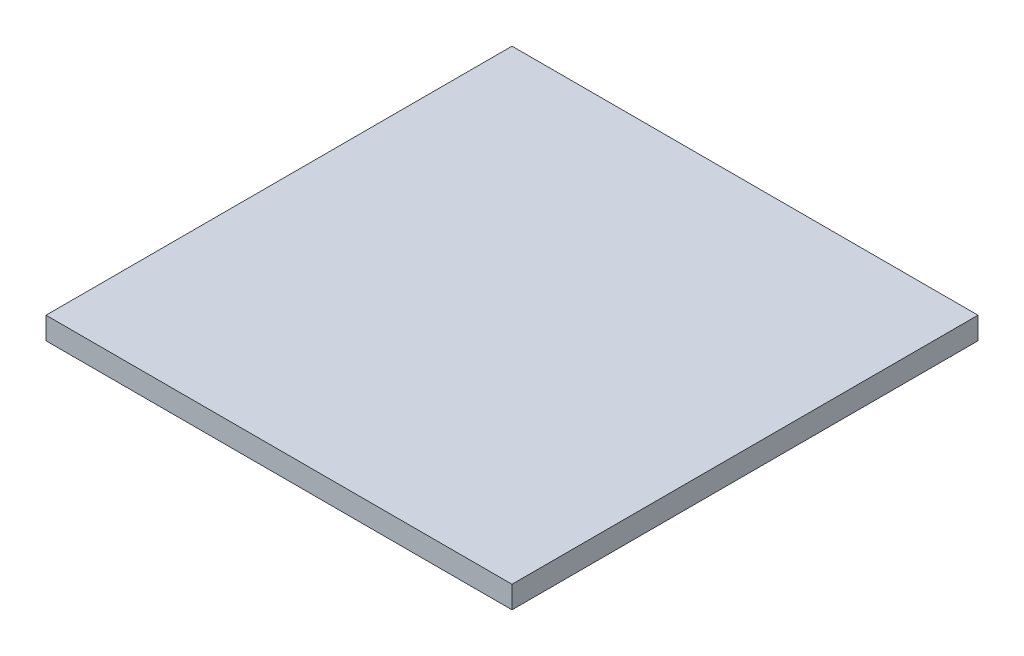
ISO-10303-21;
HEADER;
FILE_DESCRIPTION(('STEP AP214'),'2;1');
FILE_NAME('part.step','',(''),(''),'','','');
FILE_SCHEMA(('AUTOMOTIVE_DESIGN { 1 0 10303 214 1 1 1 1 }'));
ENDSEC;
DATA;
#1=APPLICATION_CONTEXT('core data for automotive mechanical design processes');
#2=APPLICATION_PROTOCOL_DEFINITION('international standard','automotive_design',2000,#1);
#3=PRODUCT_CONTEXT('',#1,'mechanical');
#4=PRODUCT('Part','Part','',(#3));
#5=PRODUCT_RELATED_PRODUCT_CATEGORY('part','',(#4));
#6=PRODUCT_DEFINITION_FORMATION('','',#4);
#7=PRODUCT_DEFINITION_CONTEXT('part definition',#1,'design');
#8=PRODUCT_DEFINITION('design','',#6,#7);
#9=PRODUCT_DEFINITION_SHAPE('','',#8);
#10=(LENGTH_UNIT() NAMED_UNIT(*) SI_UNIT(.MILLI.,.METRE.));
#11=(NAMED_UNIT(*) PLANE_ANGLE_UNIT() SI_UNIT($,.RADIAN.));
#12=(NAMED_UNIT(*) SI_UNIT($,.STERADIAN.) SOLID_ANGLE_UNIT());
#13=UNCERTAINTY_MEASURE_WITH_UNIT(LENGTH_MEASURE(1.E-05),#10,'distance_accuracy_value','');
#14=(GEOMETRIC_REPRESENTATION_CONTEXT(3) GLOBAL_UNCERTAINTY_ASSIGNED_CONTEXT((#13)) GLOBAL_UNIT_ASSIGNED_CONTEXT((#10,
#11,#12)) REPRESENTATION_CONTEXT('',''));
#15=CARTESIAN_POINT('',(0.,0.,0.));
#16=DIRECTION('',(0.,0.,1.));
#17=DIRECTION('',(1.,0.,0.));
#18=AXIS2_PLACEMENT_3D('',#15,#16,#17);
#19=CARTESIAN_POINT('',(0.,2.,0.));
#20=DIRECTION('',(1.,0.,0.));
#21=DIRECTION('',(0.,0.,-1.));
#22=AXIS2_PLACEMENT_3D('',#19,#20,#21);
#23=PLANE('',#22);
#24=DIRECTION('',(0.,0.,1.));
#25=VECTOR('',#24,1.);
#26=CARTESIAN_POINT('',(0.,0.,0.));
#27=LINE('',#26,#25);
#28=CARTESIAN_POINT('',(0.,0.,0.));
#29=VERTEX_POINT('',#28);
#30=CARTESIAN_POINT('',(0.,0.,42.));
#31=VERTEX_POINT('',#30);
#32=EDGE_CURVE('E100',#29,#31,#27,.T.);
#33=ORIENTED_EDGE('',*,*,#32,.T.);
#34=DIRECTION('',(0.,-1.,0.));
#35=VECTOR('',#34,1.);
#36=CARTESIAN_POINT('',(0.,2.,42.));
#37=LINE('',#36,#35);
#38=CARTESIAN_POINT('',(0.,2.,42.));
#39=VERTEX_POINT('',#38);
#40=EDGE_CURVE('E11',#39,#31,#37,.T.);
#41=ORIENTED_EDGE('',*,*,#40,.F.);
#42=DIRECTION('',(0.,0.,1.));
#43=VECTOR('',#42,1.);
#44=CARTESIAN_POINT('',(0.,2.,0.));
#45=LINE('',#44,#43);
#46=CARTESIAN_POINT('',(0.,2.,0.));
#47=VERTEX_POINT('',#46);
#48=EDGE_CURVE('E88',#47,#39,#45,.T.);
#49=ORIENTED_EDGE('',*,*,#48,.F.);
#50=DIRECTION('',(0.,-1.,0.));
#51=VECTOR('',#50,1.);
#52=CARTESIAN_POINT('',(0.,2.,0.));
#53=LINE('',#52,#51);
#54=EDGE_CURVE('E96',#47,#29,#53,.T.);
#55=ORIENTED_EDGE('',*,*,#54,.T.);
#56=EDGE_LOOP('',(#33,#41,#49,#55));
#57=FACE_BOUND('',#56,.T.);
#58=ADVANCED_FACE('F37',(#57),#23,.F.);
#59=CARTESIAN_POINT('',(0.,2.,42.));
#60=DIRECTION('',(0.,0.,-1.));
#61=DIRECTION('',(-1.,0.,0.));
#62=AXIS2_PLACEMENT_3D('',#59,#60,#61);
#63=PLANE('',#62);
#64=DIRECTION('',(1.,0.,0.));
#65=VECTOR('',#64,1.);
#66=CARTESIAN_POINT('',(0.,0.,42.));
#67=LINE('',#66,#65);
#68=CARTESIAN_POINT('',(42.,0.,42.));
#69=VERTEX_POINT('',#68);
#70=EDGE_CURVE('E92',#31,#69,#67,.T.);
#71=ORIENTED_EDGE('',*,*,#70,.T.);
#72=DIRECTION('',(0.,-1.,0.));
#73=VECTOR('',#72,1.);
#74=CARTESIAN_POINT('',(42.,2.,42.));
#75=LINE('',#74,#73);
#76=CARTESIAN_POINT('',(42.,2.,42.));
#77=VERTEX_POINT('',#76);
#78=EDGE_CURVE('E45',#77,#69,#75,.T.);
#79=ORIENTED_EDGE('',*,*,#78,.F.);
#80=DIRECTION('',(1.,0.,0.));
#81=VECTOR('',#80,1.);
#82=CARTESIAN_POINT('',(0.,2.,42.));
#83=LINE('',#82,#81);
#84=EDGE_CURVE('E83',#39,#77,#83,.T.);
#85=ORIENTED_EDGE('',*,*,#84,.F.);
#86=ORIENTED_EDGE('',*,*,#40,.T.);
#87=EDGE_LOOP('',(#71,#79,#85,#86));
#88=FACE_BOUND('',#87,.T.);
#89=ADVANCED_FACE('F91',(#88),#63,.F.);
#90=CARTESIAN_POINT('',(42.,2.,0.));
#91=DIRECTION('',(-1.,0.,0.));
#92=DIRECTION('',(0.,0.,1.));
#93=AXIS2_PLACEMENT_3D('',#90,#91,#92);
#94=PLANE('',#93);
#95=DIRECTION('',(0.,0.,-1.));
#96=VECTOR('',#95,1.);
#97=CARTESIAN_POINT('',(42.,0.,0.));
#98=LINE('',#97,#96);
#99=CARTESIAN_POINT('',(42.,0.,0.));
#100=VERTEX_POINT('',#99);
#101=EDGE_CURVE('E70',#69,#100,#98,.T.);
#102=ORIENTED_EDGE('',*,*,#101,.T.);
#103=DIRECTION('',(0.,-1.,0.));
#104=VECTOR('',#103,1.);
#105=CARTESIAN_POINT('',(42.,2.,0.));
#106=LINE('',#105,#104);
#107=CARTESIAN_POINT('',(42.,2.,0.));
#108=VERTEX_POINT('',#107);
#109=EDGE_CURVE('E93',#108,#100,#106,.T.);
#110=ORIENTED_EDGE('',*,*,#109,.F.);
#111=DIRECTION('',(0.,0.,-1.));
#112=VECTOR('',#111,1.);
#113=CARTESIAN_POINT('',(42.,2.,0.));
#114=LINE('',#113,#112);
#115=EDGE_CURVE('E86',#77,#108,#114,.T.);
#116=ORIENTED_EDGE('',*,*,#115,.F.);
#117=ORIENTED_EDGE('',*,*,#78,.T.);
#118=EDGE_LOOP('',(#102,#110,#116,#117));
#119=FACE_BOUND('',#118,.T.);
#120=ADVANCED_FACE('F94',(#119),#94,.F.);
#121=CARTESIAN_POINT('',(0.,2.,0.));
#122=DIRECTION('',(0.,0.,1.));
#123=DIRECTION('',(1.,0.,0.));
#124=AXIS2_PLACEMENT_3D('',#121,#122,#123);
#125=PLANE('',#124);
#126=DIRECTION('',(-1.,0.,0.));
#127=VECTOR('',#126,1.);
#128=CARTESIAN_POINT('',(0.,0.,0.));
#129=LINE('',#128,#127);
#130=EDGE_CURVE('E76',#100,#29,#129,.T.);
#131=ORIENTED_EDGE('',*,*,#130,.T.);
#132=ORIENTED_EDGE('',*,*,#54,.F.);
#133=DIRECTION('',(-1.,0.,0.));
#134=VECTOR('',#133,1.);
#135=CARTESIAN_POINT('',(0.,2.,0.));
#136=LINE('',#135,#134);
#137=EDGE_CURVE('E53',#108,#47,#136,.T.);
#138=ORIENTED_EDGE('',*,*,#137,.F.);
#139=ORIENTED_EDGE('',*,*,#109,.T.);
#140=EDGE_LOOP('',(#131,#132,#138,#139));
#141=FACE_BOUND('',#140,.T.);
#142=ADVANCED_FACE('F107',(#141),#125,.F.);
#143=CARTESIAN_POINT('',(0.,2.,0.));
#144=DIRECTION('',(0.,1.,0.));
#145=DIRECTION('',(0.,0.,1.));
#146=AXIS2_PLACEMENT_3D('',#143,#144,#145);
#147=PLANE('',#146);
#148=ORIENTED_EDGE('',*,*,#48,.T.);
#149=ORIENTED_EDGE('',*,*,#84,.T.);
#150=ORIENTED_EDGE('',*,*,#115,.T.);
#151=ORIENTED_EDGE('',*,*,#137,.T.);
#152=EDGE_LOOP('',(#148,#149,#150,#151));
#153=FACE_BOUND('',#152,.T.);
#154=ADVANCED_FACE('F84',(#153),#147,.T.);
#155=CARTESIAN_POINT('',(0.,0.,0.));
#156=DIRECTION('',(0.,1.,0.));
#157=DIRECTION('',(0.,0.,1.));
#158=AXIS2_PLACEMENT_3D('',#155,#156,#157);
#159=PLANE('',#158);
#160=ORIENTED_EDGE('',*,*,#32,.F.);
#161=ORIENTED_EDGE('',*,*,#130,.F.);
#162=ORIENTED_EDGE('',*,*,#101,.F.);
#163=ORIENTED_EDGE('',*,*,#70,.F.);
#164=EDGE_LOOP('',(#160,#161,#162,#163));
#165=FACE_BOUND('',#164,.T.);
#166=ADVANCED_FACE('F110',(#165),#159,.F.);
#167=CLOSED_SHELL('',(#58,#89,#120,#142,#154,#166));
#168=MANIFOLD_SOLID_BREP('B2',#167);
#169=ADVANCED_BREP_SHAPE_REPRESENTATION('',(#18,#168),#14);
#170=SHAPE_DEFINITION_REPRESENTATION(#9,#169);
ENDSEC;
END-ISO-10303-21;
